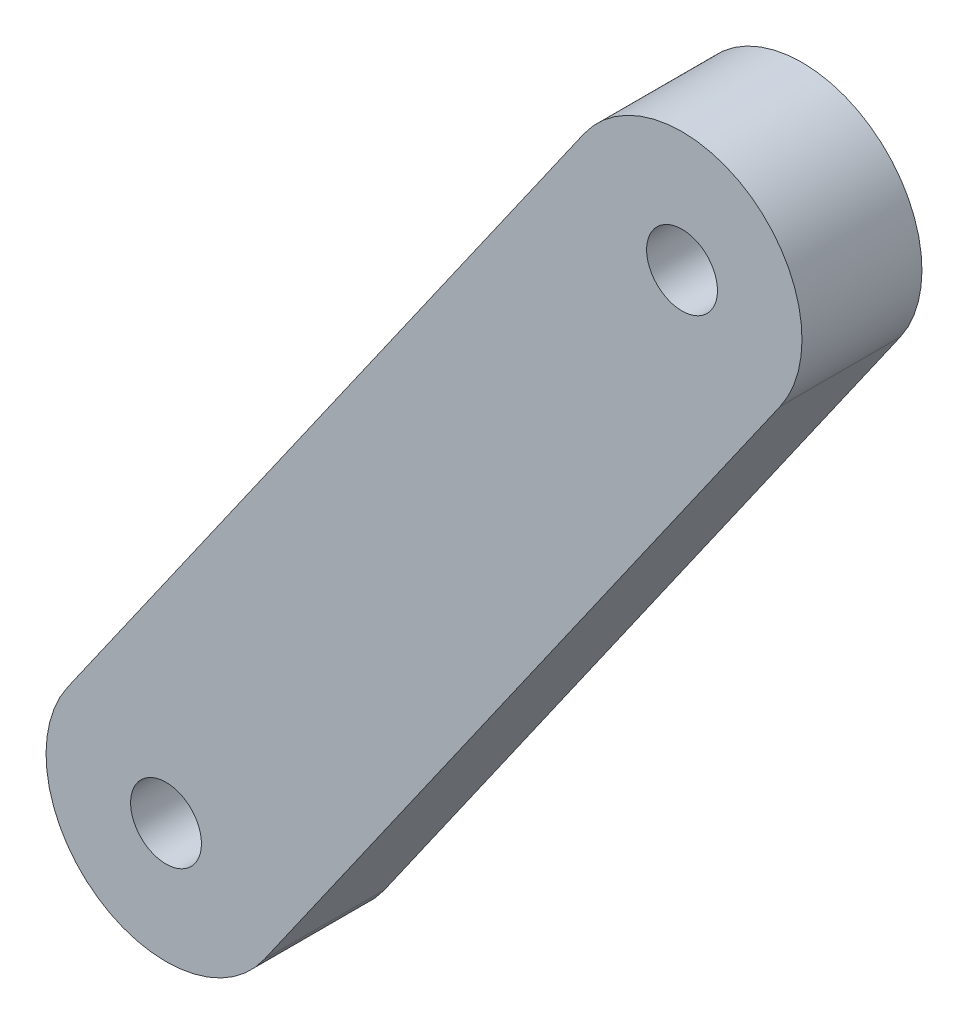
ISO-10303-21;
HEADER;
FILE_DESCRIPTION(('STEP AP214'),'2;1');
FILE_NAME('part.step','',(''),(''),'','','');
FILE_SCHEMA(('AUTOMOTIVE_DESIGN { 1 0 10303 214 1 1 1 1 }'));
ENDSEC;
DATA;
#1=APPLICATION_CONTEXT('core data for automotive mechanical design processes');
#2=APPLICATION_PROTOCOL_DEFINITION('international standard','automotive_design',2000,#1);
#3=PRODUCT_CONTEXT('',#1,'mechanical');
#4=PRODUCT('Part','Part','',(#3));
#5=PRODUCT_RELATED_PRODUCT_CATEGORY('part','',(#4));
#6=PRODUCT_DEFINITION_FORMATION('','',#4);
#7=PRODUCT_DEFINITION_CONTEXT('part definition',#1,'design');
#8=PRODUCT_DEFINITION('design','',#6,#7);
#9=PRODUCT_DEFINITION_SHAPE('','',#8);
#10=(LENGTH_UNIT() NAMED_UNIT(*) SI_UNIT(.MILLI.,.METRE.));
#11=(NAMED_UNIT(*) PLANE_ANGLE_UNIT() SI_UNIT($,.RADIAN.));
#12=(NAMED_UNIT(*) SI_UNIT($,.STERADIAN.) SOLID_ANGLE_UNIT());
#13=UNCERTAINTY_MEASURE_WITH_UNIT(LENGTH_MEASURE(1.E-05),#10,'distance_accuracy_value','');
#14=(GEOMETRIC_REPRESENTATION_CONTEXT(3) GLOBAL_UNCERTAINTY_ASSIGNED_CONTEXT((#13)) GLOBAL_UNIT_ASSIGNED_CONTEXT((#10,
#11,#12)) REPRESENTATION_CONTEXT('',''));
#15=CARTESIAN_POINT('',(0.,0.,0.));
#16=DIRECTION('',(0.,0.,1.));
#17=DIRECTION('',(1.,0.,0.));
#18=AXIS2_PLACEMENT_3D('',#15,#16,#17);
#19=CARTESIAN_POINT('',(21.8532622249748,31.2096928874106,2.54));
#20=DIRECTION('',(0.,0.,1.));
#21=DIRECTION('',(1.,0.,0.));
#22=AXIS2_PLACEMENT_3D('',#19,#20,#21);
#23=PLANE('',#22);
#24=CARTESIAN_POINT('',(21.8532622249748,31.2096928874106,2.54));
#25=DIRECTION('',(0.,0.,1.));
#26=DIRECTION('',(1.,0.,0.));
#27=AXIS2_PLACEMENT_3D('',#24,#25,#26);
#28=CIRCLE('',#27,1.5);
#29=CARTESIAN_POINT('',(23.3532622249748,31.2096928874106,2.54));
#30=VERTEX_POINT('',#29);
#31=EDGE_CURVE('E106',#30,#30,#28,.T.);
#32=ORIENTED_EDGE('',*,*,#31,.F.);
#33=EDGE_LOOP('',(#32));
#34=FACE_BOUND('',#33,.T.);
#35=CARTESIAN_POINT('',(21.8532622249748,31.2096928874106,2.54));
#36=DIRECTION('',(0.,0.,1.));
#37=DIRECTION('',(1.,0.,0.));
#38=AXIS2_PLACEMENT_3D('',#35,#36,#37);
#39=CIRCLE('',#38,5.07999999999999);
#40=CARTESIAN_POINT('',(26.0145546099629,28.2959245907473,2.54));
#41=VERTEX_POINT('',#40);
#42=CARTESIAN_POINT('',(17.6919698399867,34.1234611840739,2.54));
#43=VERTEX_POINT('',#42);
#44=EDGE_CURVE('E91',#41,#43,#39,.T.);
#45=ORIENTED_EDGE('',*,*,#44,.T.);
#46=DIRECTION('',(-0.573576436351044,-0.819152044288993,0.));
#47=VECTOR('',#46,1.);
#48=CARTESIAN_POINT('',(17.6919698399867,34.1234611840739,2.54));
#49=LINE('',#48,#47);
#50=CARTESIAN_POINT('',(-4.16129238498808,2.9137682966633,2.54));
#51=VERTEX_POINT('',#50);
#52=EDGE_CURVE('E86',#43,#51,#49,.T.);
#53=ORIENTED_EDGE('',*,*,#52,.T.);
#54=CARTESIAN_POINT('',(0.,0.,2.54));
#55=DIRECTION('',(0.,0.,1.));
#56=DIRECTION('',(1.,0.,0.));
#57=AXIS2_PLACEMENT_3D('',#54,#55,#56);
#58=CIRCLE('',#57,5.07999999999999);
#59=CARTESIAN_POINT('',(4.16129238498808,-2.9137682966633,2.54));
#60=VERTEX_POINT('',#59);
#61=EDGE_CURVE('E89',#51,#60,#58,.T.);
#62=ORIENTED_EDGE('',*,*,#61,.T.);
#63=DIRECTION('',(0.573576436351044,0.819152044288993,0.));
#64=VECTOR('',#63,1.);
#65=CARTESIAN_POINT('',(26.0145546099629,28.2959245907473,2.54));
#66=LINE('',#65,#64);
#67=EDGE_CURVE('E56',#60,#41,#66,.T.);
#68=ORIENTED_EDGE('',*,*,#67,.T.);
#69=EDGE_LOOP('',(#45,#53,#62,#68));
#70=FACE_BOUND('',#69,.T.);
#71=CARTESIAN_POINT('',(0.,0.,2.54));
#72=DIRECTION('',(0.,0.,1.));
#73=DIRECTION('',(1.,0.,0.));
#74=AXIS2_PLACEMENT_3D('',#71,#72,#73);
#75=CIRCLE('',#74,1.5);
#76=CARTESIAN_POINT('',(1.5,0.,2.54));
#77=VERTEX_POINT('',#76);
#78=EDGE_CURVE('E121',#77,#77,#75,.T.);
#79=ORIENTED_EDGE('',*,*,#78,.F.);
#80=EDGE_LOOP('',(#79));
#81=FACE_BOUND('',#80,.T.);
#82=ADVANCED_FACE('F39',(#34,#70,#81),#23,.T.);
#83=CARTESIAN_POINT('',(21.8532622249748,31.2096928874106,-2.54));
#84=DIRECTION('',(0.,0.,1.));
#85=DIRECTION('',(1.,0.,0.));
#86=AXIS2_PLACEMENT_3D('',#83,#84,#85);
#87=PLANE('',#86);
#88=CARTESIAN_POINT('',(21.8532622249748,31.2096928874106,-2.54));
#89=DIRECTION('',(0.,0.,1.));
#90=DIRECTION('',(1.,0.,0.));
#91=AXIS2_PLACEMENT_3D('',#88,#89,#90);
#92=CIRCLE('',#91,5.07999999999999);
#93=CARTESIAN_POINT('',(26.0145546099629,28.2959245907473,-2.54));
#94=VERTEX_POINT('',#93);
#95=CARTESIAN_POINT('',(17.6919698399867,34.1234611840739,-2.54));
#96=VERTEX_POINT('',#95);
#97=EDGE_CURVE('E103',#94,#96,#92,.T.);
#98=ORIENTED_EDGE('',*,*,#97,.F.);
#99=DIRECTION('',(0.573576436351044,0.819152044288993,0.));
#100=VECTOR('',#99,1.);
#101=CARTESIAN_POINT('',(26.0145546099629,28.2959245907473,-2.54));
#102=LINE('',#101,#100);
#103=CARTESIAN_POINT('',(4.16129238498808,-2.9137682966633,-2.54));
#104=VERTEX_POINT('',#103);
#105=EDGE_CURVE('E79',#104,#94,#102,.T.);
#106=ORIENTED_EDGE('',*,*,#105,.F.);
#107=CARTESIAN_POINT('',(0.,0.,-2.54));
#108=DIRECTION('',(0.,0.,1.));
#109=DIRECTION('',(1.,0.,0.));
#110=AXIS2_PLACEMENT_3D('',#107,#108,#109);
#111=CIRCLE('',#110,5.07999999999999);
#112=CARTESIAN_POINT('',(-4.16129238498808,2.9137682966633,-2.54));
#113=VERTEX_POINT('',#112);
#114=EDGE_CURVE('E73',#113,#104,#111,.T.);
#115=ORIENTED_EDGE('',*,*,#114,.F.);
#116=DIRECTION('',(-0.573576436351044,-0.819152044288993,0.));
#117=VECTOR('',#116,1.);
#118=CARTESIAN_POINT('',(17.6919698399867,34.1234611840739,-2.54));
#119=LINE('',#118,#117);
#120=EDGE_CURVE('E95',#96,#113,#119,.T.);
#121=ORIENTED_EDGE('',*,*,#120,.F.);
#122=EDGE_LOOP('',(#98,#106,#115,#121));
#123=FACE_BOUND('',#122,.T.);
#124=CARTESIAN_POINT('',(21.8532622249748,31.2096928874106,-2.54));
#125=DIRECTION('',(0.,0.,1.));
#126=DIRECTION('',(1.,0.,0.));
#127=AXIS2_PLACEMENT_3D('',#124,#125,#126);
#128=CIRCLE('',#127,1.5);
#129=CARTESIAN_POINT('',(23.3532622249748,31.2096928874106,-2.54));
#130=VERTEX_POINT('',#129);
#131=EDGE_CURVE('E118',#130,#130,#128,.T.);
#132=ORIENTED_EDGE('',*,*,#131,.T.);
#133=EDGE_LOOP('',(#132));
#134=FACE_BOUND('',#133,.T.);
#135=CARTESIAN_POINT('',(0.,0.,-2.54));
#136=DIRECTION('',(0.,0.,1.));
#137=DIRECTION('',(1.,0.,0.));
#138=AXIS2_PLACEMENT_3D('',#135,#136,#137);
#139=CIRCLE('',#138,1.5);
#140=CARTESIAN_POINT('',(1.5,0.,-2.54));
#141=VERTEX_POINT('',#140);
#142=EDGE_CURVE('E124',#141,#141,#139,.T.);
#143=ORIENTED_EDGE('',*,*,#142,.T.);
#144=EDGE_LOOP('',(#143));
#145=FACE_BOUND('',#144,.T.);
#146=ADVANCED_FACE('F114',(#123,#134,#145),#87,.F.);
#147=CARTESIAN_POINT('',(21.8532622249748,31.2096928874106,2.54));
#148=DIRECTION('',(0.,0.,-1.));
#149=DIRECTION('',(-1.,0.,0.));
#150=AXIS2_PLACEMENT_3D('',#147,#148,#149);
#151=CYLINDRICAL_SURFACE('',#150,5.07999999999999);
#152=ORIENTED_EDGE('',*,*,#97,.T.);
#153=DIRECTION('',(0.,0.,-1.));
#154=VECTOR('',#153,1.);
#155=CARTESIAN_POINT('',(17.6919698399867,34.1234611840739,2.54));
#156=LINE('',#155,#154);
#157=EDGE_CURVE('E11',#43,#96,#156,.T.);
#158=ORIENTED_EDGE('',*,*,#157,.F.);
#159=ORIENTED_EDGE('',*,*,#44,.F.);
#160=DIRECTION('',(0.,0.,-1.));
#161=VECTOR('',#160,1.);
#162=CARTESIAN_POINT('',(26.0145546099629,28.2959245907473,2.54));
#163=LINE('',#162,#161);
#164=EDGE_CURVE('E99',#41,#94,#163,.T.);
#165=ORIENTED_EDGE('',*,*,#164,.T.);
#166=EDGE_LOOP('',(#152,#158,#159,#165));
#167=FACE_BOUND('',#166,.T.);
#168=ADVANCED_FACE('F41',(#167),#151,.T.);
#169=CARTESIAN_POINT('',(17.6919698399867,34.1234611840739,2.54));
#170=DIRECTION('',(0.819152044288993,-0.573576436351044,0.));
#171=DIRECTION('',(0.573576436351044,0.819152044288993,0.));
#172=AXIS2_PLACEMENT_3D('',#169,#170,#171);
#173=PLANE('',#172);
#174=ORIENTED_EDGE('',*,*,#120,.T.);
#175=DIRECTION('',(0.,0.,-1.));
#176=VECTOR('',#175,1.);
#177=CARTESIAN_POINT('',(-4.16129238498808,2.9137682966633,2.54));
#178=LINE('',#177,#176);
#179=EDGE_CURVE('E48',#51,#113,#178,.T.);
#180=ORIENTED_EDGE('',*,*,#179,.F.);
#181=ORIENTED_EDGE('',*,*,#52,.F.);
#182=ORIENTED_EDGE('',*,*,#157,.T.);
#183=EDGE_LOOP('',(#174,#180,#181,#182));
#184=FACE_BOUND('',#183,.T.);
#185=ADVANCED_FACE('F94',(#184),#173,.F.);
#186=CARTESIAN_POINT('',(0.,0.,2.54));
#187=DIRECTION('',(0.,0.,-1.));
#188=DIRECTION('',(-1.,0.,0.));
#189=AXIS2_PLACEMENT_3D('',#186,#187,#188);
#190=CYLINDRICAL_SURFACE('',#189,5.07999999999999);
#191=ORIENTED_EDGE('',*,*,#114,.T.);
#192=DIRECTION('',(0.,0.,-1.));
#193=VECTOR('',#192,1.);
#194=CARTESIAN_POINT('',(4.16129238498808,-2.9137682966633,2.54));
#195=LINE('',#194,#193);
#196=EDGE_CURVE('E96',#60,#104,#195,.T.);
#197=ORIENTED_EDGE('',*,*,#196,.F.);
#198=ORIENTED_EDGE('',*,*,#61,.F.);
#199=ORIENTED_EDGE('',*,*,#179,.T.);
#200=EDGE_LOOP('',(#191,#197,#198,#199));
#201=FACE_BOUND('',#200,.T.);
#202=ADVANCED_FACE('F97',(#201),#190,.T.);
#203=CARTESIAN_POINT('',(26.0145546099629,28.2959245907473,2.54));
#204=DIRECTION('',(-0.819152044288993,0.573576436351044,0.));
#205=DIRECTION('',(-0.573576436351044,-0.819152044288993,0.));
#206=AXIS2_PLACEMENT_3D('',#203,#204,#205);
#207=PLANE('',#206);
#208=ORIENTED_EDGE('',*,*,#105,.T.);
#209=ORIENTED_EDGE('',*,*,#164,.F.);
#210=ORIENTED_EDGE('',*,*,#67,.F.);
#211=ORIENTED_EDGE('',*,*,#196,.T.);
#212=EDGE_LOOP('',(#208,#209,#210,#211));
#213=FACE_BOUND('',#212,.T.);
#214=ADVANCED_FACE('F111',(#213),#207,.F.);
#215=CARTESIAN_POINT('',(21.8532622249748,31.2096928874106,2.54));
#216=DIRECTION('',(0.,0.,-1.));
#217=DIRECTION('',(-1.,0.,0.));
#218=AXIS2_PLACEMENT_3D('',#215,#216,#217);
#219=CYLINDRICAL_SURFACE('',#218,1.5);
#220=ORIENTED_EDGE('',*,*,#31,.T.);
#221=EDGE_LOOP('',(#220));
#222=FACE_BOUND('',#221,.T.);
#223=ORIENTED_EDGE('',*,*,#131,.F.);
#224=EDGE_LOOP('',(#223));
#225=FACE_BOUND('',#224,.T.);
#226=ADVANCED_FACE('F141',(#222,#225),#219,.F.);
#227=CARTESIAN_POINT('',(0.,0.,2.54));
#228=DIRECTION('',(0.,0.,-1.));
#229=DIRECTION('',(-1.,0.,0.));
#230=AXIS2_PLACEMENT_3D('',#227,#228,#229);
#231=CYLINDRICAL_SURFACE('',#230,1.5);
#232=ORIENTED_EDGE('',*,*,#78,.T.);
#233=EDGE_LOOP('',(#232));
#234=FACE_BOUND('',#233,.T.);
#235=ORIENTED_EDGE('',*,*,#142,.F.);
#236=EDGE_LOOP('',(#235));
#237=FACE_BOUND('',#236,.T.);
#238=ADVANCED_FACE('F130',(#234,#237),#231,.F.);
#239=CLOSED_SHELL('',(#82,#146,#168,#185,#202,#214,#226,#238));
#240=MANIFOLD_SOLID_BREP('B2',#239);
#241=ADVANCED_BREP_SHAPE_REPRESENTATION('',(#18,#240),#14);
#242=SHAPE_DEFINITION_REPRESENTATION(#9,#241);
ENDSEC;
END-ISO-10303-21;
